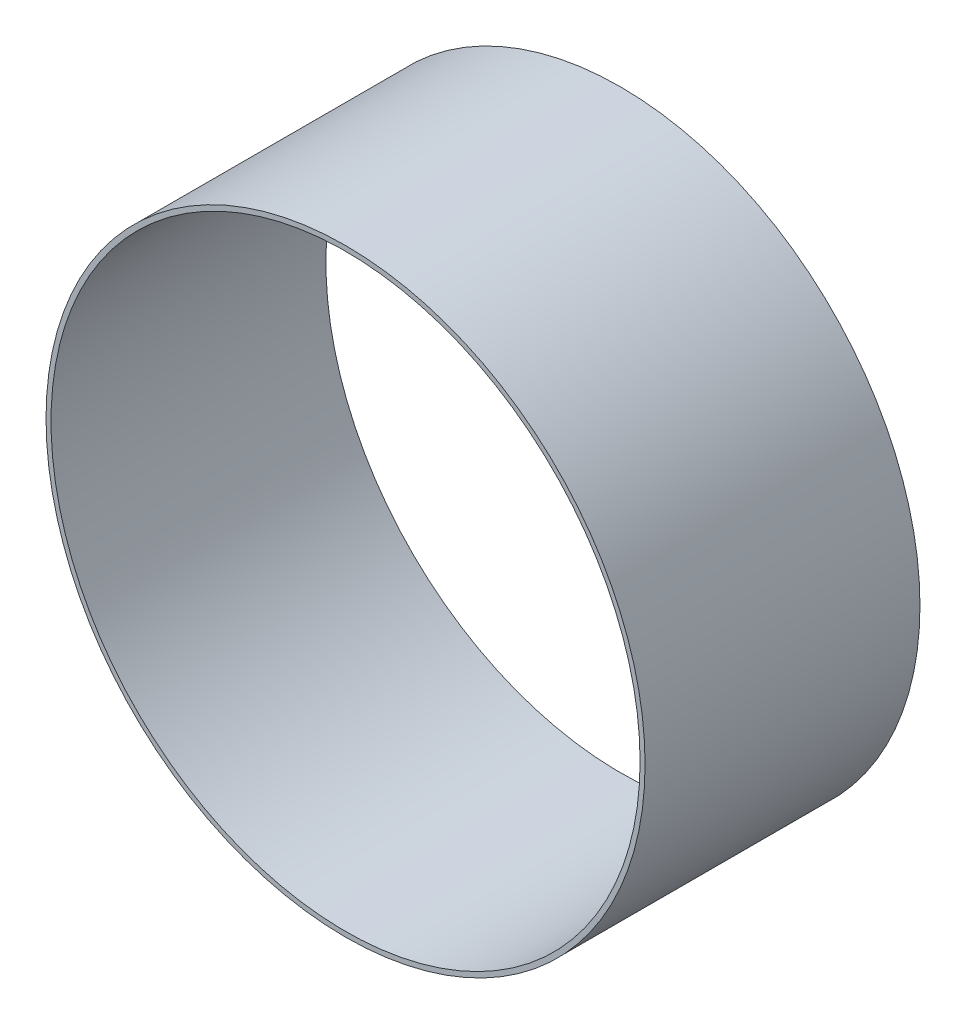
ISO-10303-21;
HEADER;
FILE_DESCRIPTION(('STEP AP214'),'2;1');
FILE_NAME('part.step','',(''),(''),'','','');
FILE_SCHEMA(('AUTOMOTIVE_DESIGN { 1 0 10303 214 1 1 1 1 }'));
ENDSEC;
DATA;
#1=APPLICATION_CONTEXT('core data for automotive mechanical design processes');
#2=APPLICATION_PROTOCOL_DEFINITION('international standard','automotive_design',2000,#1);
#3=PRODUCT_CONTEXT('',#1,'mechanical');
#4=PRODUCT('Part','Part','',(#3));
#5=PRODUCT_RELATED_PRODUCT_CATEGORY('part','',(#4));
#6=PRODUCT_DEFINITION_FORMATION('','',#4);
#7=PRODUCT_DEFINITION_CONTEXT('part definition',#1,'design');
#8=PRODUCT_DEFINITION('design','',#6,#7);
#9=PRODUCT_DEFINITION_SHAPE('','',#8);
#10=(LENGTH_UNIT() NAMED_UNIT(*) SI_UNIT(.MILLI.,.METRE.));
#11=(NAMED_UNIT(*) PLANE_ANGLE_UNIT() SI_UNIT($,.RADIAN.));
#12=(NAMED_UNIT(*) SI_UNIT($,.STERADIAN.) SOLID_ANGLE_UNIT());
#13=UNCERTAINTY_MEASURE_WITH_UNIT(LENGTH_MEASURE(1.E-05),#10,'distance_accuracy_value','');
#14=(GEOMETRIC_REPRESENTATION_CONTEXT(3) GLOBAL_UNCERTAINTY_ASSIGNED_CONTEXT((#13)) GLOBAL_UNIT_ASSIGNED_CONTEXT((#10,
#11,#12)) REPRESENTATION_CONTEXT('',''));
#15=CARTESIAN_POINT('',(0.,0.,0.));
#16=DIRECTION('',(0.,0.,1.));
#17=DIRECTION('',(1.,0.,0.));
#18=AXIS2_PLACEMENT_3D('',#15,#16,#17);
#19=CARTESIAN_POINT('',(0.,0.,0.));
#20=DIRECTION('',(0.,0.,-1.));
#21=DIRECTION('',(1.,0.,0.));
#22=AXIS2_PLACEMENT_3D('',#19,#20,#21);
#23=CYLINDRICAL_SURFACE('',#22,1.52539954);
#24=CARTESIAN_POINT('',(0.,0.,1.39999974));
#25=DIRECTION('',(0.,0.,1.));
#26=DIRECTION('',(1.,0.,0.));
#27=AXIS2_PLACEMENT_3D('',#24,#25,#26);
#28=CIRCLE('',#27,1.52539954);
#29=CARTESIAN_POINT('',(1.52539954,0.,1.39999974));
#30=VERTEX_POINT('',#29);
#31=EDGE_CURVE('E11',#30,#30,#28,.T.);
#32=ORIENTED_EDGE('',*,*,#31,.F.);
#33=DIRECTION('',(0.,0.,1.));
#34=VECTOR('',#33,1.);
#35=CARTESIAN_POINT('',(1.52539954,0.,0.));
#36=LINE('',#35,#34);
#37=CARTESIAN_POINT('',(1.52539954,0.,0.));
#38=VERTEX_POINT('',#37);
#39=EDGE_CURVE('E24',#38,#30,#36,.T.);
#40=ORIENTED_EDGE('',*,*,#39,.F.);
#41=CARTESIAN_POINT('',(0.,0.,0.));
#42=DIRECTION('',(0.,0.,1.));
#43=DIRECTION('',(1.,0.,0.));
#44=AXIS2_PLACEMENT_3D('',#41,#42,#43);
#45=CIRCLE('',#44,1.52539954);
#46=EDGE_CURVE('E46',#38,#38,#45,.T.);
#47=ORIENTED_EDGE('',*,*,#46,.T.);
#48=ORIENTED_EDGE('',*,*,#39,.T.);
#49=EDGE_LOOP('',(#32,#40,#47,#48));
#50=FACE_BOUND('',#49,.T.);
#51=ADVANCED_FACE('F17',(#50),#23,.T.);
#52=CARTESIAN_POINT('',(0.,0.,0.));
#53=DIRECTION('',(0.,0.,-1.));
#54=DIRECTION('',(1.,0.,0.));
#55=AXIS2_PLACEMENT_3D('',#52,#53,#54);
#56=CYLINDRICAL_SURFACE('',#55,1.49999954);
#57=DIRECTION('',(0.,0.,1.));
#58=VECTOR('',#57,1.);
#59=CARTESIAN_POINT('',(1.49999954,0.,0.));
#60=LINE('',#59,#58);
#61=CARTESIAN_POINT('',(1.49999954,0.,0.));
#62=VERTEX_POINT('',#61);
#63=CARTESIAN_POINT('',(1.49999954,0.,1.39999974));
#64=VERTEX_POINT('',#63);
#65=EDGE_CURVE('E40',#62,#64,#60,.T.);
#66=ORIENTED_EDGE('',*,*,#65,.T.);
#67=CARTESIAN_POINT('',(0.,0.,1.39999974));
#68=DIRECTION('',(0.,0.,1.));
#69=DIRECTION('',(1.,0.,0.));
#70=AXIS2_PLACEMENT_3D('',#67,#68,#69);
#71=CIRCLE('',#70,1.49999954);
#72=EDGE_CURVE('E45',#64,#64,#71,.T.);
#73=ORIENTED_EDGE('',*,*,#72,.T.);
#74=ORIENTED_EDGE('',*,*,#65,.F.);
#75=CARTESIAN_POINT('',(0.,0.,0.));
#76=DIRECTION('',(0.,0.,1.));
#77=DIRECTION('',(1.,0.,0.));
#78=AXIS2_PLACEMENT_3D('',#75,#76,#77);
#79=CIRCLE('',#78,1.49999954);
#80=EDGE_CURVE('E43',#62,#62,#79,.T.);
#81=ORIENTED_EDGE('',*,*,#80,.F.);
#82=EDGE_LOOP('',(#66,#73,#74,#81));
#83=FACE_BOUND('',#82,.T.);
#84=ADVANCED_FACE('F42',(#83),#56,.F.);
#85=CARTESIAN_POINT('',(1.52539954,0.,0.));
#86=DIRECTION('',(0.,0.,-1.));
#87=DIRECTION('',(-1.,0.,0.));
#88=AXIS2_PLACEMENT_3D('',#85,#86,#87);
#89=PLANE('',#88);
#90=ORIENTED_EDGE('',*,*,#46,.F.);
#91=EDGE_LOOP('',(#90));
#92=FACE_BOUND('',#91,.T.);
#93=ORIENTED_EDGE('',*,*,#80,.T.);
#94=EDGE_LOOP('',(#93));
#95=FACE_BOUND('',#94,.T.);
#96=ADVANCED_FACE('F49',(#92,#95),#89,.T.);
#97=CARTESIAN_POINT('',(1.52539954,0.,1.39999974));
#98=DIRECTION('',(0.,0.,-1.));
#99=DIRECTION('',(-1.,0.,0.));
#100=AXIS2_PLACEMENT_3D('',#97,#98,#99);
#101=PLANE('',#100);
#102=ORIENTED_EDGE('',*,*,#31,.T.);
#103=EDGE_LOOP('',(#102));
#104=FACE_BOUND('',#103,.T.);
#105=ORIENTED_EDGE('',*,*,#72,.F.);
#106=EDGE_LOOP('',(#105));
#107=FACE_BOUND('',#106,.T.);
#108=ADVANCED_FACE('F56',(#104,#107),#101,.F.);
#109=CLOSED_SHELL('',(#51,#84,#96,#108));
#110=MANIFOLD_SOLID_BREP('B1',#109);
#111=ADVANCED_BREP_SHAPE_REPRESENTATION('',(#18,#110),#14);
#112=SHAPE_DEFINITION_REPRESENTATION(#9,#111);
ENDSEC;
END-ISO-10303-21;
